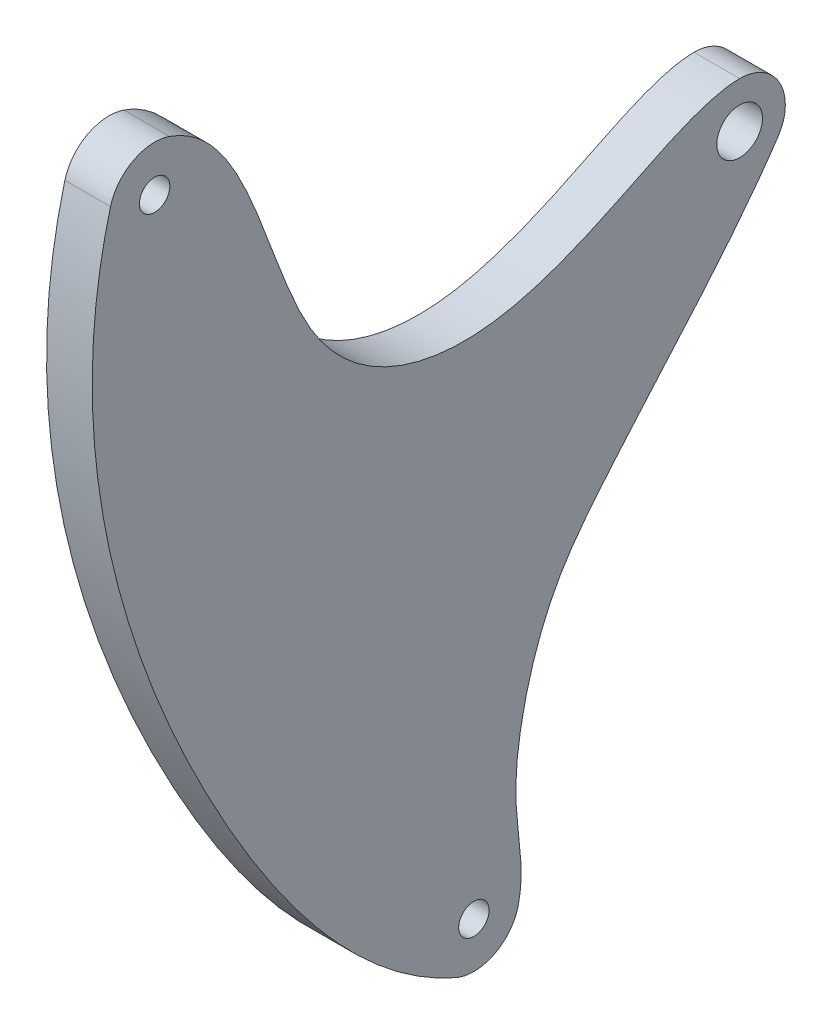
ISO-10303-21;
HEADER;
FILE_DESCRIPTION(('STEP AP214'),'2;1');
FILE_NAME('part.step','',(''),(''),'','','');
FILE_SCHEMA(('AUTOMOTIVE_DESIGN { 1 0 10303 214 1 1 1 1 }'));
ENDSEC;
DATA;
#1=APPLICATION_CONTEXT('core data for automotive mechanical design processes');
#2=APPLICATION_PROTOCOL_DEFINITION('international standard','automotive_design',2000,#1);
#3=PRODUCT_CONTEXT('',#1,'mechanical');
#4=PRODUCT('Part','Part','',(#3));
#5=PRODUCT_RELATED_PRODUCT_CATEGORY('part','',(#4));
#6=PRODUCT_DEFINITION_FORMATION('','',#4);
#7=PRODUCT_DEFINITION_CONTEXT('part definition',#1,'design');
#8=PRODUCT_DEFINITION('design','',#6,#7);
#9=PRODUCT_DEFINITION_SHAPE('','',#8);
#10=(LENGTH_UNIT() NAMED_UNIT(*) SI_UNIT(.MILLI.,.METRE.));
#11=(NAMED_UNIT(*) PLANE_ANGLE_UNIT() SI_UNIT($,.RADIAN.));
#12=(NAMED_UNIT(*) SI_UNIT($,.STERADIAN.) SOLID_ANGLE_UNIT());
#13=UNCERTAINTY_MEASURE_WITH_UNIT(LENGTH_MEASURE(1.E-05),#10,'distance_accuracy_value','');
#14=(GEOMETRIC_REPRESENTATION_CONTEXT(3) GLOBAL_UNCERTAINTY_ASSIGNED_CONTEXT((#13)) GLOBAL_UNIT_ASSIGNED_CONTEXT((#10,
#11,#12)) REPRESENTATION_CONTEXT('',''));
#15=CARTESIAN_POINT('',(0.,0.,0.));
#16=DIRECTION('',(0.,0.,1.));
#17=DIRECTION('',(1.,0.,0.));
#18=AXIS2_PLACEMENT_3D('',#15,#16,#17);
#19=CARTESIAN_POINT('',(4.5,-67.8773549767663,-114.955402134271));
#20=DIRECTION('',(1.,0.,0.));
#21=DIRECTION('',(0.,0.,-1.));
#22=AXIS2_PLACEMENT_3D('',#19,#20,#21);
#23=PLANE('',#22);
#24=CARTESIAN_POINT('',(4.5,113.902662733038,150.009011459616));
#25=DIRECTION('',(1.,0.,0.));
#26=DIRECTION('',(0.,0.,-1.));
#27=AXIS2_PLACEMENT_3D('',#24,#25,#26);
#28=CIRCLE('',#27,2.);
#29=CARTESIAN_POINT('',(4.5,113.902662733038,148.009011459616));
#30=VERTEX_POINT('',#29);
#31=EDGE_CURVE('E12',#30,#30,#28,.T.);
#32=ORIENTED_EDGE('',*,*,#31,.F.);
#33=EDGE_LOOP('',(#32));
#34=FACE_BOUND('',#33,.T.);
#35=CARTESIAN_POINT('',(4.5,10.4951007065817,108.039544989996));
#36=DIRECTION('',(1.,0.,0.));
#37=DIRECTION('',(0.,0.,-1.));
#38=AXIS2_PLACEMENT_3D('',#35,#36,#37);
#39=CIRCLE('',#38,2.);
#40=CARTESIAN_POINT('',(4.5,10.4951007065817,106.039544989996));
#41=VERTEX_POINT('',#40);
#42=EDGE_CURVE('E56',#41,#41,#39,.T.);
#43=ORIENTED_EDGE('',*,*,#42,.F.);
#44=EDGE_LOOP('',(#43));
#45=FACE_BOUND('',#44,.T.);
#46=CARTESIAN_POINT('',(4.5,82.685759931947,73.1031925672378));
#47=DIRECTION('',(1.,0.,0.));
#48=DIRECTION('',(0.,0.,-1.));
#49=AXIS2_PLACEMENT_3D('',#46,#47,#48);
#50=CIRCLE('',#49,3.00000000000001);
#51=CARTESIAN_POINT('',(4.5,82.685759931947,70.1031925672378));
#52=VERTEX_POINT('',#51);
#53=EDGE_CURVE('E188',#52,#52,#50,.T.);
#54=ORIENTED_EDGE('',*,*,#53,.F.);
#55=EDGE_LOOP('',(#54));
#56=FACE_BOUND('',#55,.T.);
#57=CARTESIAN_POINT('',(4.500012,119.569371520836,148.037105905514));
#58=CARTESIAN_POINT('',(4.500012,115.777884330549,137.141424956021));
#59=CARTESIAN_POINT('',(4.500012,83.7070266817184,134.207738740131));
#60=CARTESIAN_POINT('',(4.500012,74.375699665518,110.415829431785));
#61=CARTESIAN_POINT('',(4.500012,80.7529509819503,92.0886486945547));
#62=CARTESIAN_POINT('',(4.500012,88.685759931947,77.7789563777724));
#63=CARTESIAN_POINT('',(4.500012,88.685759931947,73.1031925672378));
#64=B_SPLINE_CURVE_WITH_KNOTS('',3,(#57,#58,#59,#60,#61,#62,#63),.UNSPECIFIED.,.F.,.F.,(4,1,1,1,
4),(0.022808471602162,0.378151790312881,0.637109170511151,0.823995801251428,0.964332074981165),.UNSPECIFIED.);
#65=CARTESIAN_POINT('',(4.500006,88.685759931947,73.1031925672378));
#66=VERTEX_POINT('',#65);
#67=CARTESIAN_POINT('',(4.500006,119.569371520836,148.037105905514));
#68=VERTEX_POINT('',#67);
#69=EDGE_CURVE('E107',#66,#68,#64,.F.);
#70=ORIENTED_EDGE('',*,*,#69,.T.);
#71=CARTESIAN_POINT('',(4.5,119.569371520836,148.037105905514));
#72=CARTESIAN_POINT('',(4.5,119.980513589897,149.218614001038));
#73=CARTESIAN_POINT('',(4.5,119.885195740416,150.46650333456));
#74=CARTESIAN_POINT('',(4.5,119.78993700312,151.713618778769));
#75=CARTESIAN_POINT('',(4.5,119.203645824096,152.819630300427));
#76=CARTESIAN_POINT('',(4.5,118.617846422382,153.924714106659));
#77=CARTESIAN_POINT('',(4.5,117.638345927067,154.704186757073));
#78=CARTESIAN_POINT('',(4.5,116.659452650923,155.483176191052));
#79=CARTESIAN_POINT('',(4.5,115.45025401317,155.80599008901));
#80=B_SPLINE_CURVE_WITH_KNOTS('',2,(#71,#72,#73,#74,#75,#76,#77,#78,#79),.UNSPECIFIED.,.F.,.F.,
(3,2,2,2,3),(0.,0.25,0.5,0.75,1.),.UNSPECIFIED.);
#81=CARTESIAN_POINT('',(4.500006,115.45025401317,155.80599008901));
#82=VERTEX_POINT('',#81);
#83=EDGE_CURVE('E117',#68,#82,#80,.T.);
#84=ORIENTED_EDGE('',*,*,#83,.T.);
#85=CARTESIAN_POINT('',(4.500012,4.9948186732209,110.436813759552));
#86=CARTESIAN_POINT('',(4.500012,10.6403155268826,123.38981481973));
#87=CARTESIAN_POINT('',(4.500012,50.1449996162263,152.19578017397));
#88=CARTESIAN_POINT('',(4.500012,92.2913325536682,161.988615073386));
#89=CARTESIAN_POINT('',(4.500012,115.45025401317,155.80599008901));
#90=B_SPLINE_CURVE_WITH_KNOTS('',3,(#85,#86,#87,#88,#89),.UNSPECIFIED.,.F.,.F.,(4,1,4),
(0.0178116728179407,0.376055543468979,0.983264819488637),.UNSPECIFIED.);
#91=CARTESIAN_POINT('',(4.500006,4.9948186732209,110.436813759552));
#92=VERTEX_POINT('',#91);
#93=EDGE_CURVE('E121',#82,#92,#90,.F.);
#94=ORIENTED_EDGE('',*,*,#93,.T.);
#95=CARTESIAN_POINT('',(4.5,4.99481867322091,110.436813759552));
#96=CARTESIAN_POINT('',(4.5,4.46165265650984,109.213520193242));
#97=CARTESIAN_POINT('',(4.5,4.49724801646867,107.879036087738));
#98=CARTESIAN_POINT('',(4.5,4.53282272335806,106.545326273965));
#99=CARTESIAN_POINT('',(4.5,5.13090622776834,105.35153130077));
#100=CARTESIAN_POINT('',(4.5,5.72851941192108,104.158675102771));
#101=CARTESIAN_POINT('',(4.5,6.7762817922269,103.331001066208));
#102=CARTESIAN_POINT('',(4.5,7.82343645648718,102.50380709154));
#103=CARTESIAN_POINT('',(4.5,9.12304759221262,102.198528789766));
#104=B_SPLINE_CURVE_WITH_KNOTS('',2,(#95,#96,#97,#98,#99,#100,#101,#102,#103),.UNSPECIFIED.,.F.,
.F.,(3,2,2,2,3),(0.,0.25,0.5,0.75,1.),.UNSPECIFIED.);
#105=CARTESIAN_POINT('',(4.500006,9.12304759221263,102.198528789766));
#106=VERTEX_POINT('',#105);
#107=EDGE_CURVE('E69',#92,#106,#104,.T.);
#108=ORIENTED_EDGE('',*,*,#107,.T.);
#109=CARTESIAN_POINT('',(4.500012,81.492677056481,67.2230094704057));
#110=CARTESIAN_POINT('',(4.500012,80.4499542011275,67.434576825043));
#111=CARTESIAN_POINT('',(4.500012,69.3867135250755,74.8534543619199));
#112=CARTESIAN_POINT('',(4.500012,58.4382171162196,85.7864153037282));
#113=CARTESIAN_POINT('',(4.500012,43.0377388424126,97.9369848618885));
#114=CARTESIAN_POINT('',(4.500012,32.4152670041331,101.651722539039));
#115=CARTESIAN_POINT('',(4.500012,20.3304880586708,103.12805406378));
#116=CARTESIAN_POINT('',(4.500012,12.874033903834,101.317423126917));
#117=CARTESIAN_POINT('',(4.500012,9.12304759221263,102.198528789766));
#118=B_SPLINE_CURVE_WITH_KNOTS('',3,(#109,#110,#111,#112,#113,#114,#115,#116,#117),
.UNSPECIFIED.,.F.,.F.,(4,1,1,1,1,1,4),(0.,0.0380176686374704,0.465996019136833,
0.563834945272351,0.738533636188433,0.860627051005963,1.),.UNSPECIFIED.);
#119=CARTESIAN_POINT('',(4.500006,81.492677056481,67.2230094704058));
#120=VERTEX_POINT('',#119);
#121=EDGE_CURVE('E173',#106,#120,#118,.F.);
#122=ORIENTED_EDGE('',*,*,#121,.T.);
#123=CARTESIAN_POINT('',(4.5,81.492677056481,67.2230094704057));
#124=CARTESIAN_POINT('',(4.5,82.8158048634025,66.9545482503221));
#125=CARTESIAN_POINT('',(4.5,84.126908256855,67.2788392550138));
#126=CARTESIAN_POINT('',(4.5,85.4372600401191,67.6029443548988));
#127=CARTESIAN_POINT('',(4.5,86.4832263733526,68.4578455805857));
#128=CARTESIAN_POINT('',(4.5,87.5283797128379,69.3120823208779));
#129=CARTESIAN_POINT('',(4.5,88.1072356834576,70.5326671976328));
#130=CARTESIAN_POINT('',(4.5,88.685759931947,71.7525525998449));
#131=CARTESIAN_POINT('',(4.5,88.685759931947,73.1031925672378));
#132=B_SPLINE_CURVE_WITH_KNOTS('',2,(#123,#124,#125,#126,#127,#128,#129,#130,#131),
.UNSPECIFIED.,.F.,.F.,(3,2,2,2,3),(0.,0.25,0.5,0.75,1.),.UNSPECIFIED.);
#133=EDGE_CURVE('E128',#120,#66,#132,.T.);
#134=ORIENTED_EDGE('',*,*,#133,.T.);
#135=EDGE_LOOP('',(#70,#84,#94,#108,#122,#134));
#136=FACE_BOUND('',#135,.T.);
#137=ADVANCED_FACE('F48',(#34,#45,#56,#136),#23,.T.);
#138=CARTESIAN_POINT('',(-1.5,-67.8773549767663,-114.955402134271));
#139=DIRECTION('',(1.,0.,0.));
#140=DIRECTION('',(0.,0.,-1.));
#141=AXIS2_PLACEMENT_3D('',#138,#139,#140);
#142=PLANE('',#141);
#143=CARTESIAN_POINT('',(-1.5,113.902662733038,150.009011459616));
#144=DIRECTION('',(1.,0.,0.));
#145=DIRECTION('',(0.,0.,-1.));
#146=AXIS2_PLACEMENT_3D('',#143,#144,#145);
#147=CIRCLE('',#146,2.);
#148=CARTESIAN_POINT('',(-1.5,113.902662733038,148.009011459616));
#149=VERTEX_POINT('',#148);
#150=EDGE_CURVE('E178',#149,#149,#147,.T.);
#151=ORIENTED_EDGE('',*,*,#150,.T.);
#152=EDGE_LOOP('',(#151));
#153=FACE_BOUND('',#152,.T.);
#154=CARTESIAN_POINT('',(-1.5,10.4951007065817,108.039544989996));
#155=DIRECTION('',(1.,0.,0.));
#156=DIRECTION('',(0.,0.,-1.));
#157=AXIS2_PLACEMENT_3D('',#154,#155,#156);
#158=CIRCLE('',#157,2.);
#159=CARTESIAN_POINT('',(-1.5,10.4951007065817,106.039544989996));
#160=VERTEX_POINT('',#159);
#161=EDGE_CURVE('E181',#160,#160,#158,.T.);
#162=ORIENTED_EDGE('',*,*,#161,.T.);
#163=EDGE_LOOP('',(#162));
#164=FACE_BOUND('',#163,.T.);
#165=CARTESIAN_POINT('',(-1.5,82.685759931947,73.1031925672378));
#166=DIRECTION('',(1.,0.,0.));
#167=DIRECTION('',(0.,0.,-1.));
#168=AXIS2_PLACEMENT_3D('',#165,#166,#167);
#169=CIRCLE('',#168,3.00000000000001);
#170=CARTESIAN_POINT('',(-1.5,82.685759931947,70.1031925672378));
#171=VERTEX_POINT('',#170);
#172=EDGE_CURVE('E183',#171,#171,#169,.T.);
#173=ORIENTED_EDGE('',*,*,#172,.T.);
#174=EDGE_LOOP('',(#173));
#175=FACE_BOUND('',#174,.T.);
#176=CARTESIAN_POINT('',(-1.5,88.685759931947,73.1031925672378));
#177=CARTESIAN_POINT('',(-1.5,88.685759931947,77.7789563777724));
#178=CARTESIAN_POINT('',(-1.5,80.7529509819503,92.0886486945547));
#179=CARTESIAN_POINT('',(-1.5,74.375699665518,110.415829431785));
#180=CARTESIAN_POINT('',(-1.5,83.7070266817184,134.207738740131));
#181=CARTESIAN_POINT('',(-1.5,115.777884330549,137.141424956021));
#182=CARTESIAN_POINT('',(-1.5,119.569371520836,148.037105905514));
#183=B_SPLINE_CURVE_WITH_KNOTS('',3,(#176,#177,#178,#179,#180,#181,#182),.UNSPECIFIED.,.F.,.F.,
(4,1,1,1,4),(0.0228084716021621,0.163144745331899,0.350031376072176,0.608988756270446,
0.964332074981165),.UNSPECIFIED.);
#184=CARTESIAN_POINT('',(-1.5,88.685759931947,73.1031925672378));
#185=VERTEX_POINT('',#184);
#186=CARTESIAN_POINT('',(-1.5,119.569371520836,148.037105905514));
#187=VERTEX_POINT('',#186);
#188=EDGE_CURVE('E76',#185,#187,#183,.T.);
#189=ORIENTED_EDGE('',*,*,#188,.F.);
#190=CARTESIAN_POINT('',(-1.5,82.685759931947,73.1031925672378));
#191=DIRECTION('',(1.,0.,0.));
#192=DIRECTION('',(0.,0.,-1.));
#193=AXIS2_PLACEMENT_3D('',#190,#191,#192);
#194=CIRCLE('',#193,5.99999999999998);
#195=CARTESIAN_POINT('',(-1.5,81.492677056481,67.2230094704057));
#196=VERTEX_POINT('',#195);
#197=EDGE_CURVE('E113',#196,#185,#194,.T.);
#198=ORIENTED_EDGE('',*,*,#197,.F.);
#199=CARTESIAN_POINT('',(-1.5,9.12304759221263,102.198528789766));
#200=CARTESIAN_POINT('',(-1.5,12.874033903834,101.317423126917));
#201=CARTESIAN_POINT('',(-1.5,20.3304880586708,103.12805406378));
#202=CARTESIAN_POINT('',(-1.5,32.4152670041331,101.651722539039));
#203=CARTESIAN_POINT('',(-1.5,43.0377388424126,97.9369848618885));
#204=CARTESIAN_POINT('',(-1.5,58.4382171162196,85.7864153037282));
#205=CARTESIAN_POINT('',(-1.5,69.3867135250755,74.8534543619199));
#206=CARTESIAN_POINT('',(-1.5,80.4499542011275,67.434576825043));
#207=CARTESIAN_POINT('',(-1.5,81.492677056481,67.2230094704057));
#208=B_SPLINE_CURVE_WITH_KNOTS('',3,(#199,#200,#201,#202,#203,#204,#205,#206,#207),
.UNSPECIFIED.,.F.,.F.,(4,1,1,1,1,1,4),(0.,0.139372948994037,0.261466363811567,0.436165054727649,
0.534003980863167,0.96198233136253,1.),.UNSPECIFIED.);
#209=CARTESIAN_POINT('',(-1.5,9.12304759221263,102.198528789766));
#210=VERTEX_POINT('',#209);
#211=EDGE_CURVE('E228',#210,#196,#208,.T.);
#212=ORIENTED_EDGE('',*,*,#211,.F.);
#213=CARTESIAN_POINT('',(-1.5,10.4951007065817,108.039544989996));
#214=DIRECTION('',(1.,0.,0.));
#215=DIRECTION('',(0.,0.,-1.));
#216=AXIS2_PLACEMENT_3D('',#213,#214,#215);
#217=CIRCLE('',#216,6.);
#218=CARTESIAN_POINT('',(-1.5,4.9948186732209,110.436813759552));
#219=VERTEX_POINT('',#218);
#220=EDGE_CURVE('E222',#219,#210,#217,.T.);
#221=ORIENTED_EDGE('',*,*,#220,.F.);
#222=CARTESIAN_POINT('',(-1.5,115.45025401317,155.80599008901));
#223=CARTESIAN_POINT('',(-1.5,92.2913325536682,161.988615073386));
#224=CARTESIAN_POINT('',(-1.5,50.1449996162263,152.19578017397));
#225=CARTESIAN_POINT('',(-1.5,10.6403155268826,123.38981481973));
#226=CARTESIAN_POINT('',(-1.5,4.9948186732209,110.436813759552));
#227=B_SPLINE_CURVE_WITH_KNOTS('',3,(#222,#223,#224,#225,#226),.UNSPECIFIED.,.F.,.F.,(4,1,4),
(0.0178116728179407,0.625020948837599,0.983264819488637),.UNSPECIFIED.);
#228=CARTESIAN_POINT('',(-1.5,115.45025401317,155.80599008901));
#229=VERTEX_POINT('',#228);
#230=EDGE_CURVE('E212',#229,#219,#227,.T.);
#231=ORIENTED_EDGE('',*,*,#230,.F.);
#232=CARTESIAN_POINT('',(-1.5,113.902662733038,150.009011459616));
#233=DIRECTION('',(1.,0.,0.));
#234=DIRECTION('',(0.,0.,-1.));
#235=AXIS2_PLACEMENT_3D('',#232,#233,#234);
#236=CIRCLE('',#235,6.);
#237=EDGE_CURVE('E225',#187,#229,#236,.T.);
#238=ORIENTED_EDGE('',*,*,#237,.F.);
#239=EDGE_LOOP('',(#189,#198,#212,#221,#231,#238));
#240=FACE_BOUND('',#239,.T.);
#241=ADVANCED_FACE('F150',(#153,#164,#175,#240),#142,.F.);
#242=CARTESIAN_POINT('',(4.5,113.902662733038,150.009011459616));
#243=DIRECTION('',(-1.,0.,0.));
#244=DIRECTION('',(0.,0.,1.));
#245=AXIS2_PLACEMENT_3D('',#242,#243,#244);
#246=CYLINDRICAL_SURFACE('',#245,2.);
#247=ORIENTED_EDGE('',*,*,#31,.T.);
#248=EDGE_LOOP('',(#247));
#249=FACE_BOUND('',#248,.T.);
#250=ORIENTED_EDGE('',*,*,#150,.F.);
#251=EDGE_LOOP('',(#250));
#252=FACE_BOUND('',#251,.T.);
#253=ADVANCED_FACE('F363',(#249,#252),#246,.F.);
#254=CARTESIAN_POINT('',(4.5,10.4951007065817,108.039544989996));
#255=DIRECTION('',(-1.,0.,0.));
#256=DIRECTION('',(0.,0.,1.));
#257=AXIS2_PLACEMENT_3D('',#254,#255,#256);
#258=CYLINDRICAL_SURFACE('',#257,2.);
#259=ORIENTED_EDGE('',*,*,#42,.T.);
#260=EDGE_LOOP('',(#259));
#261=FACE_BOUND('',#260,.T.);
#262=ORIENTED_EDGE('',*,*,#161,.F.);
#263=EDGE_LOOP('',(#262));
#264=FACE_BOUND('',#263,.T.);
#265=ADVANCED_FACE('F49',(#261,#264),#258,.F.);
#266=CARTESIAN_POINT('',(-1.5,82.685759931947,73.1031925672378));
#267=DIRECTION('',(1.,0.,0.));
#268=DIRECTION('',(0.,0.,-1.));
#269=AXIS2_PLACEMENT_3D('',#266,#267,#268);
#270=CYLINDRICAL_SURFACE('',#269,3.00000000000001);
#271=ORIENTED_EDGE('',*,*,#172,.F.);
#272=EDGE_LOOP('',(#271));
#273=FACE_BOUND('',#272,.T.);
#274=ORIENTED_EDGE('',*,*,#53,.T.);
#275=EDGE_LOOP('',(#274));
#276=FACE_BOUND('',#275,.T.);
#277=ADVANCED_FACE('F149',(#273,#276),#270,.F.);
#278=DIRECTION('',(1.,0.,0.));
#279=VECTOR('',#278,1.);
#280=SURFACE_OF_LINEAR_EXTRUSION('',#183,#279);
#281=DIRECTION('',(1.,0.,0.));
#282=VECTOR('',#281,1.);
#283=CARTESIAN_POINT('',(-1.5,88.685759931947,73.1031925672378));
#284=LINE('',#283,#282);
#285=EDGE_CURVE('E194',#185,#66,#284,.T.);
#286=ORIENTED_EDGE('',*,*,#285,.F.);
#287=ORIENTED_EDGE('',*,*,#188,.T.);
#288=DIRECTION('',(1.,0.,0.));
#289=VECTOR('',#288,1.);
#290=CARTESIAN_POINT('',(-1.5,119.569371520836,148.037105905514));
#291=LINE('',#290,#289);
#292=EDGE_CURVE('E102',#187,#68,#291,.T.);
#293=ORIENTED_EDGE('',*,*,#292,.T.);
#294=ORIENTED_EDGE('',*,*,#69,.F.);
#295=EDGE_LOOP('',(#286,#287,#293,#294));
#296=FACE_BOUND('',#295,.T.);
#297=ADVANCED_FACE('F106',(#296),#280,.T.);
#298=CARTESIAN_POINT('',(-1.5,82.685759931947,73.1031925672378));
#299=DIRECTION('',(1.,0.,0.));
#300=DIRECTION('',(0.,0.,-1.));
#301=AXIS2_PLACEMENT_3D('',#298,#299,#300);
#302=CYLINDRICAL_SURFACE('',#301,5.99999999999998);
#303=DIRECTION('',(1.,0.,0.));
#304=VECTOR('',#303,1.);
#305=CARTESIAN_POINT('',(-1.5,81.492677056481,67.2230094704057));
#306=LINE('',#305,#304);
#307=EDGE_CURVE('E254',#196,#120,#306,.T.);
#308=ORIENTED_EDGE('',*,*,#307,.F.);
#309=ORIENTED_EDGE('',*,*,#197,.T.);
#310=ORIENTED_EDGE('',*,*,#285,.T.);
#311=ORIENTED_EDGE('',*,*,#133,.F.);
#312=EDGE_LOOP('',(#308,#309,#310,#311));
#313=FACE_BOUND('',#312,.T.);
#314=ADVANCED_FACE('F241',(#313),#302,.T.);
#315=DIRECTION('',(1.,0.,0.));
#316=VECTOR('',#315,1.);
#317=SURFACE_OF_LINEAR_EXTRUSION('',#208,#316);
#318=DIRECTION('',(1.,0.,0.));
#319=VECTOR('',#318,1.);
#320=CARTESIAN_POINT('',(-1.5,9.12304759221263,102.198528789766));
#321=LINE('',#320,#319);
#322=EDGE_CURVE('E250',#210,#106,#321,.T.);
#323=ORIENTED_EDGE('',*,*,#322,.F.);
#324=ORIENTED_EDGE('',*,*,#211,.T.);
#325=ORIENTED_EDGE('',*,*,#307,.T.);
#326=ORIENTED_EDGE('',*,*,#121,.F.);
#327=EDGE_LOOP('',(#323,#324,#325,#326));
#328=FACE_BOUND('',#327,.T.);
#329=ADVANCED_FACE('F240',(#328),#317,.T.);
#330=CARTESIAN_POINT('',(-1.5,10.4951007065817,108.039544989996));
#331=DIRECTION('',(1.,0.,0.));
#332=DIRECTION('',(0.,0.,-1.));
#333=AXIS2_PLACEMENT_3D('',#330,#331,#332);
#334=CYLINDRICAL_SURFACE('',#333,6.);
#335=DIRECTION('',(1.,0.,0.));
#336=VECTOR('',#335,1.);
#337=CARTESIAN_POINT('',(-1.5,4.9948186732209,110.436813759552));
#338=LINE('',#337,#336);
#339=EDGE_CURVE('E258',#219,#92,#338,.T.);
#340=ORIENTED_EDGE('',*,*,#339,.F.);
#341=ORIENTED_EDGE('',*,*,#220,.T.);
#342=ORIENTED_EDGE('',*,*,#322,.T.);
#343=ORIENTED_EDGE('',*,*,#107,.F.);
#344=EDGE_LOOP('',(#340,#341,#342,#343));
#345=FACE_BOUND('',#344,.T.);
#346=ADVANCED_FACE('F209',(#345),#334,.T.);
#347=DIRECTION('',(1.,0.,0.));
#348=VECTOR('',#347,1.);
#349=SURFACE_OF_LINEAR_EXTRUSION('',#227,#348);
#350=DIRECTION('',(1.,0.,0.));
#351=VECTOR('',#350,1.);
#352=CARTESIAN_POINT('',(-1.5,115.45025401317,155.80599008901));
#353=LINE('',#352,#351);
#354=EDGE_CURVE('E111',#229,#82,#353,.T.);
#355=ORIENTED_EDGE('',*,*,#354,.F.);
#356=ORIENTED_EDGE('',*,*,#230,.T.);
#357=ORIENTED_EDGE('',*,*,#339,.T.);
#358=ORIENTED_EDGE('',*,*,#93,.F.);
#359=EDGE_LOOP('',(#355,#356,#357,#358));
#360=FACE_BOUND('',#359,.T.);
#361=ADVANCED_FACE('F200',(#360),#349,.T.);
#362=CARTESIAN_POINT('',(-1.5,113.902662733038,150.009011459616));
#363=DIRECTION('',(1.,0.,0.));
#364=DIRECTION('',(0.,0.,-1.));
#365=AXIS2_PLACEMENT_3D('',#362,#363,#364);
#366=CYLINDRICAL_SURFACE('',#365,6.);
#367=ORIENTED_EDGE('',*,*,#292,.F.);
#368=ORIENTED_EDGE('',*,*,#237,.T.);
#369=ORIENTED_EDGE('',*,*,#354,.T.);
#370=ORIENTED_EDGE('',*,*,#83,.F.);
#371=EDGE_LOOP('',(#367,#368,#369,#370));
#372=FACE_BOUND('',#371,.T.);
#373=ADVANCED_FACE('F119',(#372),#366,.T.);
#374=CLOSED_SHELL('',(#137,#241,#253,#265,#277,#297,#314,#329,#346,#361,#373));
#375=MANIFOLD_SOLID_BREP('B2',#374);
#376=ADVANCED_BREP_SHAPE_REPRESENTATION('',(#18,#375),#14);
#377=SHAPE_DEFINITION_REPRESENTATION(#9,#376);
ENDSEC;
END-ISO-10303-21;
